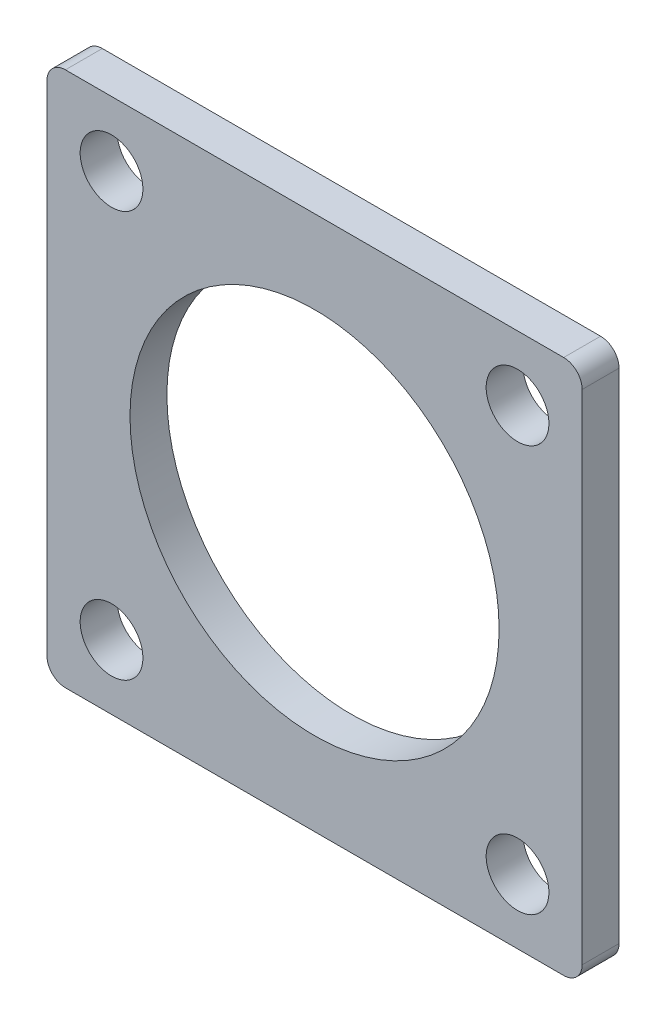
ISO-10303-21;
HEADER;
FILE_DESCRIPTION(('STEP AP214'),'2;1');
FILE_NAME('part.step','',(''),(''),'','','');
FILE_SCHEMA(('AUTOMOTIVE_DESIGN { 1 0 10303 214 1 1 1 1 }'));
ENDSEC;
DATA;
#1=APPLICATION_CONTEXT('core data for automotive mechanical design processes');
#2=APPLICATION_PROTOCOL_DEFINITION('international standard','automotive_design',2000,#1);
#3=PRODUCT_CONTEXT('',#1,'mechanical');
#4=PRODUCT('Part','Part','',(#3));
#5=PRODUCT_RELATED_PRODUCT_CATEGORY('part','',(#4));
#6=PRODUCT_DEFINITION_FORMATION('','',#4);
#7=PRODUCT_DEFINITION_CONTEXT('part definition',#1,'design');
#8=PRODUCT_DEFINITION('design','',#6,#7);
#9=PRODUCT_DEFINITION_SHAPE('','',#8);
#10=(LENGTH_UNIT() NAMED_UNIT(*) SI_UNIT(.MILLI.,.METRE.));
#11=(NAMED_UNIT(*) PLANE_ANGLE_UNIT() SI_UNIT($,.RADIAN.));
#12=(NAMED_UNIT(*) SI_UNIT($,.STERADIAN.) SOLID_ANGLE_UNIT());
#13=UNCERTAINTY_MEASURE_WITH_UNIT(LENGTH_MEASURE(1.E-05),#10,'distance_accuracy_value','');
#14=(GEOMETRIC_REPRESENTATION_CONTEXT(3) GLOBAL_UNCERTAINTY_ASSIGNED_CONTEXT((#13)) GLOBAL_UNIT_ASSIGNED_CONTEXT((#10,
#11,#12)) REPRESENTATION_CONTEXT('',''));
#15=CARTESIAN_POINT('',(0.,0.,0.));
#16=DIRECTION('',(0.,0.,1.));
#17=DIRECTION('',(1.,0.,0.));
#18=AXIS2_PLACEMENT_3D('',#15,#16,#17);
#19=CARTESIAN_POINT('',(14.5,14.5,2.));
#20=DIRECTION('',(-1.,0.,0.));
#21=DIRECTION('',(0.,-1.,0.));
#22=AXIS2_PLACEMENT_3D('',#19,#20,#21);
#23=PLANE('',#22);
#24=DIRECTION('',(0.,1.,0.));
#25=VECTOR('',#24,1.);
#26=CARTESIAN_POINT('',(14.5,14.5,2.));
#27=LINE('',#26,#25);
#28=CARTESIAN_POINT('',(14.5,-13.5,2.));
#29=VERTEX_POINT('',#28);
#30=CARTESIAN_POINT('',(14.5,13.5,2.));
#31=VERTEX_POINT('',#30);
#32=EDGE_CURVE('E124',#29,#31,#27,.T.);
#33=ORIENTED_EDGE('',*,*,#32,.F.);
#34=DIRECTION('',(0.,0.,-1.));
#35=VECTOR('',#34,1.);
#36=CARTESIAN_POINT('',(14.5,-13.5,2.));
#37=LINE('',#36,#35);
#38=CARTESIAN_POINT('',(14.5,-13.5,0.));
#39=VERTEX_POINT('',#38);
#40=EDGE_CURVE('E109',#29,#39,#37,.T.);
#41=ORIENTED_EDGE('',*,*,#40,.T.);
#42=DIRECTION('',(0.,1.,0.));
#43=VECTOR('',#42,1.);
#44=CARTESIAN_POINT('',(14.5,14.5,0.));
#45=LINE('',#44,#43);
#46=CARTESIAN_POINT('',(14.5,13.5,0.));
#47=VERTEX_POINT('',#46);
#48=EDGE_CURVE('E121',#39,#47,#45,.T.);
#49=ORIENTED_EDGE('',*,*,#48,.T.);
#50=DIRECTION('',(0.,0.,-1.));
#51=VECTOR('',#50,1.);
#52=CARTESIAN_POINT('',(14.5,13.5,2.));
#53=LINE('',#52,#51);
#54=EDGE_CURVE('E126',#47,#31,#53,.F.);
#55=ORIENTED_EDGE('',*,*,#54,.T.);
#56=EDGE_LOOP('',(#33,#41,#49,#55));
#57=FACE_BOUND('',#56,.T.);
#58=ADVANCED_FACE('F36',(#57),#23,.F.);
#59=CARTESIAN_POINT('',(-14.5,14.5,2.));
#60=DIRECTION('',(0.,-1.,0.));
#61=DIRECTION('',(0.,0.,-1.));
#62=AXIS2_PLACEMENT_3D('',#59,#60,#61);
#63=PLANE('',#62);
#64=DIRECTION('',(-1.,0.,0.));
#65=VECTOR('',#64,1.);
#66=CARTESIAN_POINT('',(-14.5,14.5,2.));
#67=LINE('',#66,#65);
#68=CARTESIAN_POINT('',(13.5,14.5,2.));
#69=VERTEX_POINT('',#68);
#70=CARTESIAN_POINT('',(-13.5,14.5,2.));
#71=VERTEX_POINT('',#70);
#72=EDGE_CURVE('E188',#69,#71,#67,.T.);
#73=ORIENTED_EDGE('',*,*,#72,.F.);
#74=DIRECTION('',(0.,0.,-1.));
#75=VECTOR('',#74,1.);
#76=CARTESIAN_POINT('',(13.5,14.5,2.));
#77=LINE('',#76,#75);
#78=CARTESIAN_POINT('',(13.5,14.5,0.));
#79=VERTEX_POINT('',#78);
#80=EDGE_CURVE('E11',#69,#79,#77,.T.);
#81=ORIENTED_EDGE('',*,*,#80,.T.);
#82=DIRECTION('',(-1.,0.,0.));
#83=VECTOR('',#82,1.);
#84=CARTESIAN_POINT('',(-14.5,14.5,0.));
#85=LINE('',#84,#83);
#86=CARTESIAN_POINT('',(-13.5,14.5,0.));
#87=VERTEX_POINT('',#86);
#88=EDGE_CURVE('E131',#79,#87,#85,.T.);
#89=ORIENTED_EDGE('',*,*,#88,.T.);
#90=DIRECTION('',(0.,0.,-1.));
#91=VECTOR('',#90,1.);
#92=CARTESIAN_POINT('',(-13.5,14.5,2.));
#93=LINE('',#92,#91);
#94=EDGE_CURVE('E45',#87,#71,#93,.F.);
#95=ORIENTED_EDGE('',*,*,#94,.T.);
#96=EDGE_LOOP('',(#73,#81,#89,#95));
#97=FACE_BOUND('',#96,.T.);
#98=ADVANCED_FACE('F206',(#97),#63,.F.);
#99=CARTESIAN_POINT('',(-14.5,14.5,2.));
#100=DIRECTION('',(1.,0.,0.));
#101=DIRECTION('',(0.,1.,0.));
#102=AXIS2_PLACEMENT_3D('',#99,#100,#101);
#103=PLANE('',#102);
#104=DIRECTION('',(0.,-1.,0.));
#105=VECTOR('',#104,1.);
#106=CARTESIAN_POINT('',(-14.5,14.5,0.));
#107=LINE('',#106,#105);
#108=CARTESIAN_POINT('',(-14.5,13.5,0.));
#109=VERTEX_POINT('',#108);
#110=CARTESIAN_POINT('',(-14.5,-13.5,0.));
#111=VERTEX_POINT('',#110);
#112=EDGE_CURVE('E135',#109,#111,#107,.T.);
#113=ORIENTED_EDGE('',*,*,#112,.T.);
#114=DIRECTION('',(0.,0.,-1.));
#115=VECTOR('',#114,1.);
#116=CARTESIAN_POINT('',(-14.5,-13.5,2.));
#117=LINE('',#116,#115);
#118=CARTESIAN_POINT('',(-14.5,-13.5,2.));
#119=VERTEX_POINT('',#118);
#120=EDGE_CURVE('E53',#111,#119,#117,.F.);
#121=ORIENTED_EDGE('',*,*,#120,.T.);
#122=DIRECTION('',(0.,-1.,0.));
#123=VECTOR('',#122,1.);
#124=CARTESIAN_POINT('',(-14.5,14.5,2.));
#125=LINE('',#124,#123);
#126=CARTESIAN_POINT('',(-14.5,13.5,2.));
#127=VERTEX_POINT('',#126);
#128=EDGE_CURVE('E189',#127,#119,#125,.T.);
#129=ORIENTED_EDGE('',*,*,#128,.F.);
#130=DIRECTION('',(0.,0.,-1.));
#131=VECTOR('',#130,1.);
#132=CARTESIAN_POINT('',(-14.5,13.5,2.));
#133=LINE('',#132,#131);
#134=EDGE_CURVE('E161',#127,#109,#133,.T.);
#135=ORIENTED_EDGE('',*,*,#134,.T.);
#136=EDGE_LOOP('',(#113,#121,#129,#135));
#137=FACE_BOUND('',#136,.T.);
#138=ADVANCED_FACE('F200',(#137),#103,.F.);
#139=CARTESIAN_POINT('',(-14.5,-14.5,2.));
#140=DIRECTION('',(0.,1.,0.));
#141=DIRECTION('',(0.,0.,1.));
#142=AXIS2_PLACEMENT_3D('',#139,#140,#141);
#143=PLANE('',#142);
#144=DIRECTION('',(1.,0.,0.));
#145=VECTOR('',#144,1.);
#146=CARTESIAN_POINT('',(-14.5,-14.5,0.));
#147=LINE('',#146,#145);
#148=CARTESIAN_POINT('',(-13.5,-14.5,0.));
#149=VERTEX_POINT('',#148);
#150=CARTESIAN_POINT('',(13.5,-14.5,0.));
#151=VERTEX_POINT('',#150);
#152=EDGE_CURVE('E145',#149,#151,#147,.T.);
#153=ORIENTED_EDGE('',*,*,#152,.T.);
#154=DIRECTION('',(0.,0.,-1.));
#155=VECTOR('',#154,1.);
#156=CARTESIAN_POINT('',(13.5,-14.5,2.));
#157=LINE('',#156,#155);
#158=CARTESIAN_POINT('',(13.5,-14.5,2.));
#159=VERTEX_POINT('',#158);
#160=EDGE_CURVE('E110',#151,#159,#157,.F.);
#161=ORIENTED_EDGE('',*,*,#160,.T.);
#162=DIRECTION('',(1.,0.,0.));
#163=VECTOR('',#162,1.);
#164=CARTESIAN_POINT('',(-14.5,-14.5,2.));
#165=LINE('',#164,#163);
#166=CARTESIAN_POINT('',(-13.5,-14.5,2.));
#167=VERTEX_POINT('',#166);
#168=EDGE_CURVE('E141',#167,#159,#165,.T.);
#169=ORIENTED_EDGE('',*,*,#168,.F.);
#170=DIRECTION('',(0.,0.,-1.));
#171=VECTOR('',#170,1.);
#172=CARTESIAN_POINT('',(-13.5,-14.5,2.));
#173=LINE('',#172,#171);
#174=EDGE_CURVE('E115',#167,#149,#173,.T.);
#175=ORIENTED_EDGE('',*,*,#174,.T.);
#176=EDGE_LOOP('',(#153,#161,#169,#175));
#177=FACE_BOUND('',#176,.T.);
#178=ADVANCED_FACE('F196',(#177),#143,.F.);
#179=CARTESIAN_POINT('',(0.,0.,2.));
#180=DIRECTION('',(0.,0.,1.));
#181=DIRECTION('',(1.,0.,0.));
#182=AXIS2_PLACEMENT_3D('',#179,#180,#181);
#183=PLANE('',#182);
#184=CARTESIAN_POINT('',(0.,0.,2.));
#185=DIRECTION('',(0.,0.,1.));
#186=DIRECTION('',(1.,0.,0.));
#187=AXIS2_PLACEMENT_3D('',#184,#185,#186);
#188=CIRCLE('',#187,10.);
#189=CARTESIAN_POINT('',(10.,0.,2.));
#190=VERTEX_POINT('',#189);
#191=EDGE_CURVE('E347',#190,#190,#188,.T.);
#192=ORIENTED_EDGE('',*,*,#191,.F.);
#193=EDGE_LOOP('',(#192));
#194=FACE_BOUND('',#193,.T.);
#195=CARTESIAN_POINT('',(-11.,11.,2.));
#196=DIRECTION('',(0.,0.,1.));
#197=DIRECTION('',(1.,0.,0.));
#198=AXIS2_PLACEMENT_3D('',#195,#196,#197);
#199=CIRCLE('',#198,1.7);
#200=CARTESIAN_POINT('',(-9.3,11.,2.));
#201=VERTEX_POINT('',#200);
#202=EDGE_CURVE('E179',#201,#201,#199,.T.);
#203=ORIENTED_EDGE('',*,*,#202,.F.);
#204=EDGE_LOOP('',(#203));
#205=FACE_BOUND('',#204,.T.);
#206=CARTESIAN_POINT('',(11.,11.,2.));
#207=DIRECTION('',(0.,0.,1.));
#208=DIRECTION('',(1.,0.,0.));
#209=AXIS2_PLACEMENT_3D('',#206,#207,#208);
#210=CIRCLE('',#209,1.7);
#211=CARTESIAN_POINT('',(12.7,11.,2.));
#212=VERTEX_POINT('',#211);
#213=EDGE_CURVE('E168',#212,#212,#210,.T.);
#214=ORIENTED_EDGE('',*,*,#213,.F.);
#215=EDGE_LOOP('',(#214));
#216=FACE_BOUND('',#215,.T.);
#217=CARTESIAN_POINT('',(-11.,-11.,2.));
#218=DIRECTION('',(0.,0.,1.));
#219=DIRECTION('',(1.,0.,0.));
#220=AXIS2_PLACEMENT_3D('',#217,#218,#219);
#221=CIRCLE('',#220,1.7);
#222=CARTESIAN_POINT('',(-9.3,-11.,2.));
#223=VERTEX_POINT('',#222);
#224=EDGE_CURVE('E167',#223,#223,#221,.T.);
#225=ORIENTED_EDGE('',*,*,#224,.F.);
#226=EDGE_LOOP('',(#225));
#227=FACE_BOUND('',#226,.T.);
#228=CARTESIAN_POINT('',(11.,-11.,2.));
#229=DIRECTION('',(0.,0.,1.));
#230=DIRECTION('',(1.,0.,0.));
#231=AXIS2_PLACEMENT_3D('',#228,#229,#230);
#232=CIRCLE('',#231,1.7);
#233=CARTESIAN_POINT('',(12.7,-11.,2.));
#234=VERTEX_POINT('',#233);
#235=EDGE_CURVE('E138',#234,#234,#232,.T.);
#236=ORIENTED_EDGE('',*,*,#235,.F.);
#237=EDGE_LOOP('',(#236));
#238=FACE_BOUND('',#237,.T.);
#239=ORIENTED_EDGE('',*,*,#168,.T.);
#240=CARTESIAN_POINT('',(13.5,-13.5,2.));
#241=DIRECTION('',(0.,0.,1.));
#242=DIRECTION('',(1.,0.,0.));
#243=AXIS2_PLACEMENT_3D('',#240,#241,#242);
#244=CIRCLE('',#243,1.);
#245=EDGE_CURVE('E159',#159,#29,#244,.T.);
#246=ORIENTED_EDGE('',*,*,#245,.T.);
#247=ORIENTED_EDGE('',*,*,#32,.T.);
#248=CARTESIAN_POINT('',(13.5,13.5,2.));
#249=DIRECTION('',(0.,0.,1.));
#250=DIRECTION('',(1.,0.,0.));
#251=AXIS2_PLACEMENT_3D('',#248,#249,#250);
#252=CIRCLE('',#251,1.);
#253=EDGE_CURVE('E155',#31,#69,#252,.T.);
#254=ORIENTED_EDGE('',*,*,#253,.T.);
#255=ORIENTED_EDGE('',*,*,#72,.T.);
#256=CARTESIAN_POINT('',(-13.5,13.5,2.));
#257=DIRECTION('',(0.,0.,1.));
#258=DIRECTION('',(1.,0.,0.));
#259=AXIS2_PLACEMENT_3D('',#256,#257,#258);
#260=CIRCLE('',#259,1.);
#261=EDGE_CURVE('E60',#71,#127,#260,.T.);
#262=ORIENTED_EDGE('',*,*,#261,.T.);
#263=ORIENTED_EDGE('',*,*,#128,.T.);
#264=CARTESIAN_POINT('',(-13.5,-13.5,2.));
#265=DIRECTION('',(0.,0.,1.));
#266=DIRECTION('',(1.,0.,0.));
#267=AXIS2_PLACEMENT_3D('',#264,#265,#266);
#268=CIRCLE('',#267,1.);
#269=EDGE_CURVE('E157',#119,#167,#268,.T.);
#270=ORIENTED_EDGE('',*,*,#269,.T.);
#271=EDGE_LOOP('',(#239,#246,#247,#254,#255,#262,#263,#270));
#272=FACE_BOUND('',#271,.T.);
#273=ADVANCED_FACE('F193',(#194,#205,#216,#227,#238,#272),#183,.T.);
#274=CARTESIAN_POINT('',(0.,0.,0.));
#275=DIRECTION('',(0.,0.,1.));
#276=DIRECTION('',(1.,0.,0.));
#277=AXIS2_PLACEMENT_3D('',#274,#275,#276);
#278=PLANE('',#277);
#279=CARTESIAN_POINT('',(0.,0.,0.));
#280=DIRECTION('',(0.,0.,1.));
#281=DIRECTION('',(1.,0.,0.));
#282=AXIS2_PLACEMENT_3D('',#279,#280,#281);
#283=CIRCLE('',#282,10.);
#284=CARTESIAN_POINT('',(10.,0.,0.));
#285=VERTEX_POINT('',#284);
#286=EDGE_CURVE('E346',#285,#285,#283,.T.);
#287=ORIENTED_EDGE('',*,*,#286,.T.);
#288=EDGE_LOOP('',(#287));
#289=FACE_BOUND('',#288,.T.);
#290=CARTESIAN_POINT('',(-11.,11.,0.));
#291=DIRECTION('',(0.,0.,1.));
#292=DIRECTION('',(1.,0.,0.));
#293=AXIS2_PLACEMENT_3D('',#290,#291,#292);
#294=CIRCLE('',#293,1.7);
#295=CARTESIAN_POINT('',(-9.3,11.,0.));
#296=VERTEX_POINT('',#295);
#297=EDGE_CURVE('E40',#296,#296,#294,.T.);
#298=ORIENTED_EDGE('',*,*,#297,.T.);
#299=EDGE_LOOP('',(#298));
#300=FACE_BOUND('',#299,.T.);
#301=CARTESIAN_POINT('',(11.,11.,0.));
#302=DIRECTION('',(0.,0.,1.));
#303=DIRECTION('',(1.,0.,0.));
#304=AXIS2_PLACEMENT_3D('',#301,#302,#303);
#305=CIRCLE('',#304,1.7);
#306=CARTESIAN_POINT('',(12.7,11.,0.));
#307=VERTEX_POINT('',#306);
#308=EDGE_CURVE('E165',#307,#307,#305,.T.);
#309=ORIENTED_EDGE('',*,*,#308,.T.);
#310=EDGE_LOOP('',(#309));
#311=FACE_BOUND('',#310,.T.);
#312=CARTESIAN_POINT('',(-11.,-11.,0.));
#313=DIRECTION('',(0.,0.,1.));
#314=DIRECTION('',(1.,0.,0.));
#315=AXIS2_PLACEMENT_3D('',#312,#313,#314);
#316=CIRCLE('',#315,1.7);
#317=CARTESIAN_POINT('',(-9.3,-11.,0.));
#318=VERTEX_POINT('',#317);
#319=EDGE_CURVE('E172',#318,#318,#316,.T.);
#320=ORIENTED_EDGE('',*,*,#319,.T.);
#321=EDGE_LOOP('',(#320));
#322=FACE_BOUND('',#321,.T.);
#323=CARTESIAN_POINT('',(11.,-11.,0.));
#324=DIRECTION('',(0.,0.,1.));
#325=DIRECTION('',(1.,0.,0.));
#326=AXIS2_PLACEMENT_3D('',#323,#324,#325);
#327=CIRCLE('',#326,1.7);
#328=CARTESIAN_POINT('',(12.7,-11.,0.));
#329=VERTEX_POINT('',#328);
#330=EDGE_CURVE('E132',#329,#329,#327,.T.);
#331=ORIENTED_EDGE('',*,*,#330,.T.);
#332=EDGE_LOOP('',(#331));
#333=FACE_BOUND('',#332,.T.);
#334=ORIENTED_EDGE('',*,*,#48,.F.);
#335=CARTESIAN_POINT('',(13.5,-13.5,0.));
#336=DIRECTION('',(0.,0.,1.));
#337=DIRECTION('',(1.,0.,0.));
#338=AXIS2_PLACEMENT_3D('',#335,#336,#337);
#339=CIRCLE('',#338,1.);
#340=EDGE_CURVE('E105',#39,#151,#339,.F.);
#341=ORIENTED_EDGE('',*,*,#340,.T.);
#342=ORIENTED_EDGE('',*,*,#152,.F.);
#343=CARTESIAN_POINT('',(-13.5,-13.5,0.));
#344=DIRECTION('',(0.,0.,1.));
#345=DIRECTION('',(1.,0.,0.));
#346=AXIS2_PLACEMENT_3D('',#343,#344,#345);
#347=CIRCLE('',#346,1.);
#348=EDGE_CURVE('E116',#149,#111,#347,.F.);
#349=ORIENTED_EDGE('',*,*,#348,.T.);
#350=ORIENTED_EDGE('',*,*,#112,.F.);
#351=CARTESIAN_POINT('',(-13.5,13.5,0.));
#352=DIRECTION('',(0.,0.,1.));
#353=DIRECTION('',(1.,0.,0.));
#354=AXIS2_PLACEMENT_3D('',#351,#352,#353);
#355=CIRCLE('',#354,1.);
#356=EDGE_CURVE('E125',#109,#87,#355,.F.);
#357=ORIENTED_EDGE('',*,*,#356,.T.);
#358=ORIENTED_EDGE('',*,*,#88,.F.);
#359=CARTESIAN_POINT('',(13.5,13.5,0.));
#360=DIRECTION('',(0.,0.,1.));
#361=DIRECTION('',(1.,0.,0.));
#362=AXIS2_PLACEMENT_3D('',#359,#360,#361);
#363=CIRCLE('',#362,1.);
#364=EDGE_CURVE('E130',#79,#47,#363,.F.);
#365=ORIENTED_EDGE('',*,*,#364,.T.);
#366=EDGE_LOOP('',(#334,#341,#342,#349,#350,#357,#358,#365));
#367=FACE_BOUND('',#366,.T.);
#368=ADVANCED_FACE('F128',(#289,#300,#311,#322,#333,#367),#278,.F.);
#369=CARTESIAN_POINT('',(13.5,-13.5,2.));
#370=DIRECTION('',(0.,0.,-1.));
#371=DIRECTION('',(-1.,0.,0.));
#372=AXIS2_PLACEMENT_3D('',#369,#370,#371);
#373=CYLINDRICAL_SURFACE('',#372,1.);
#374=ORIENTED_EDGE('',*,*,#245,.F.);
#375=ORIENTED_EDGE('',*,*,#160,.F.);
#376=ORIENTED_EDGE('',*,*,#340,.F.);
#377=ORIENTED_EDGE('',*,*,#40,.F.);
#378=EDGE_LOOP('',(#374,#375,#376,#377));
#379=FACE_BOUND('',#378,.T.);
#380=ADVANCED_FACE('F108',(#379),#373,.T.);
#381=CARTESIAN_POINT('',(-13.5,-13.5,2.));
#382=DIRECTION('',(0.,0.,-1.));
#383=DIRECTION('',(-1.,0.,0.));
#384=AXIS2_PLACEMENT_3D('',#381,#382,#383);
#385=CYLINDRICAL_SURFACE('',#384,1.);
#386=ORIENTED_EDGE('',*,*,#269,.F.);
#387=ORIENTED_EDGE('',*,*,#120,.F.);
#388=ORIENTED_EDGE('',*,*,#348,.F.);
#389=ORIENTED_EDGE('',*,*,#174,.F.);
#390=EDGE_LOOP('',(#386,#387,#388,#389));
#391=FACE_BOUND('',#390,.T.);
#392=ADVANCED_FACE('F198',(#391),#385,.T.);
#393=CARTESIAN_POINT('',(13.5,13.5,2.));
#394=DIRECTION('',(0.,0.,-1.));
#395=DIRECTION('',(-1.,0.,0.));
#396=AXIS2_PLACEMENT_3D('',#393,#394,#395);
#397=CYLINDRICAL_SURFACE('',#396,1.);
#398=ORIENTED_EDGE('',*,*,#253,.F.);
#399=ORIENTED_EDGE('',*,*,#54,.F.);
#400=ORIENTED_EDGE('',*,*,#364,.F.);
#401=ORIENTED_EDGE('',*,*,#80,.F.);
#402=EDGE_LOOP('',(#398,#399,#400,#401));
#403=FACE_BOUND('',#402,.T.);
#404=ADVANCED_FACE('F210',(#403),#397,.T.);
#405=CARTESIAN_POINT('',(-13.5,13.5,2.));
#406=DIRECTION('',(0.,0.,-1.));
#407=DIRECTION('',(-1.,0.,0.));
#408=AXIS2_PLACEMENT_3D('',#405,#406,#407);
#409=CYLINDRICAL_SURFACE('',#408,1.);
#410=ORIENTED_EDGE('',*,*,#261,.F.);
#411=ORIENTED_EDGE('',*,*,#94,.F.);
#412=ORIENTED_EDGE('',*,*,#356,.F.);
#413=ORIENTED_EDGE('',*,*,#134,.F.);
#414=EDGE_LOOP('',(#410,#411,#412,#413));
#415=FACE_BOUND('',#414,.T.);
#416=ADVANCED_FACE('F38',(#415),#409,.T.);
#417=CARTESIAN_POINT('',(11.,-11.,2.));
#418=DIRECTION('',(0.,0.,1.));
#419=DIRECTION('',(1.,0.,0.));
#420=AXIS2_PLACEMENT_3D('',#417,#418,#419);
#421=CYLINDRICAL_SURFACE('',#420,1.7);
#422=ORIENTED_EDGE('',*,*,#235,.T.);
#423=EDGE_LOOP('',(#422));
#424=FACE_BOUND('',#423,.T.);
#425=ORIENTED_EDGE('',*,*,#330,.F.);
#426=EDGE_LOOP('',(#425));
#427=FACE_BOUND('',#426,.T.);
#428=ADVANCED_FACE('F216',(#424,#427),#421,.F.);
#429=CARTESIAN_POINT('',(-11.,-11.,2.));
#430=DIRECTION('',(0.,0.,1.));
#431=DIRECTION('',(1.,0.,0.));
#432=AXIS2_PLACEMENT_3D('',#429,#430,#431);
#433=CYLINDRICAL_SURFACE('',#432,1.7);
#434=ORIENTED_EDGE('',*,*,#224,.T.);
#435=EDGE_LOOP('',(#434));
#436=FACE_BOUND('',#435,.T.);
#437=ORIENTED_EDGE('',*,*,#319,.F.);
#438=EDGE_LOOP('',(#437));
#439=FACE_BOUND('',#438,.T.);
#440=ADVANCED_FACE('F287',(#436,#439),#433,.F.);
#441=CARTESIAN_POINT('',(11.,11.,2.));
#442=DIRECTION('',(0.,0.,1.));
#443=DIRECTION('',(1.,0.,0.));
#444=AXIS2_PLACEMENT_3D('',#441,#442,#443);
#445=CYLINDRICAL_SURFACE('',#444,1.7);
#446=ORIENTED_EDGE('',*,*,#213,.T.);
#447=EDGE_LOOP('',(#446));
#448=FACE_BOUND('',#447,.T.);
#449=ORIENTED_EDGE('',*,*,#308,.F.);
#450=EDGE_LOOP('',(#449));
#451=FACE_BOUND('',#450,.T.);
#452=ADVANCED_FACE('F282',(#448,#451),#445,.F.);
#453=CARTESIAN_POINT('',(-11.,11.,2.));
#454=DIRECTION('',(0.,0.,1.));
#455=DIRECTION('',(1.,0.,0.));
#456=AXIS2_PLACEMENT_3D('',#453,#454,#455);
#457=CYLINDRICAL_SURFACE('',#456,1.7);
#458=ORIENTED_EDGE('',*,*,#202,.T.);
#459=EDGE_LOOP('',(#458));
#460=FACE_BOUND('',#459,.T.);
#461=ORIENTED_EDGE('',*,*,#297,.F.);
#462=EDGE_LOOP('',(#461));
#463=FACE_BOUND('',#462,.T.);
#464=ADVANCED_FACE('F261',(#460,#463),#457,.F.);
#465=CARTESIAN_POINT('',(0.,0.,0.));
#466=DIRECTION('',(0.,0.,1.));
#467=DIRECTION('',(1.,0.,0.));
#468=AXIS2_PLACEMENT_3D('',#465,#466,#467);
#469=CYLINDRICAL_SURFACE('',#468,10.);
#470=ORIENTED_EDGE('',*,*,#286,.F.);
#471=EDGE_LOOP('',(#470));
#472=FACE_BOUND('',#471,.T.);
#473=ORIENTED_EDGE('',*,*,#191,.T.);
#474=EDGE_LOOP('',(#473));
#475=FACE_BOUND('',#474,.T.);
#476=ADVANCED_FACE('F271',(#472,#475),#469,.F.);
#477=CLOSED_SHELL('',(#58,#98,#138,#178,#273,#368,#380,#392,#404,#416,#428,#440,#452,#464,#476));
#478=MANIFOLD_SOLID_BREP('B2',#477);
#479=ADVANCED_BREP_SHAPE_REPRESENTATION('',(#18,#478),#14);
#480=SHAPE_DEFINITION_REPRESENTATION(#9,#479);
ENDSEC;
END-ISO-10303-21;
